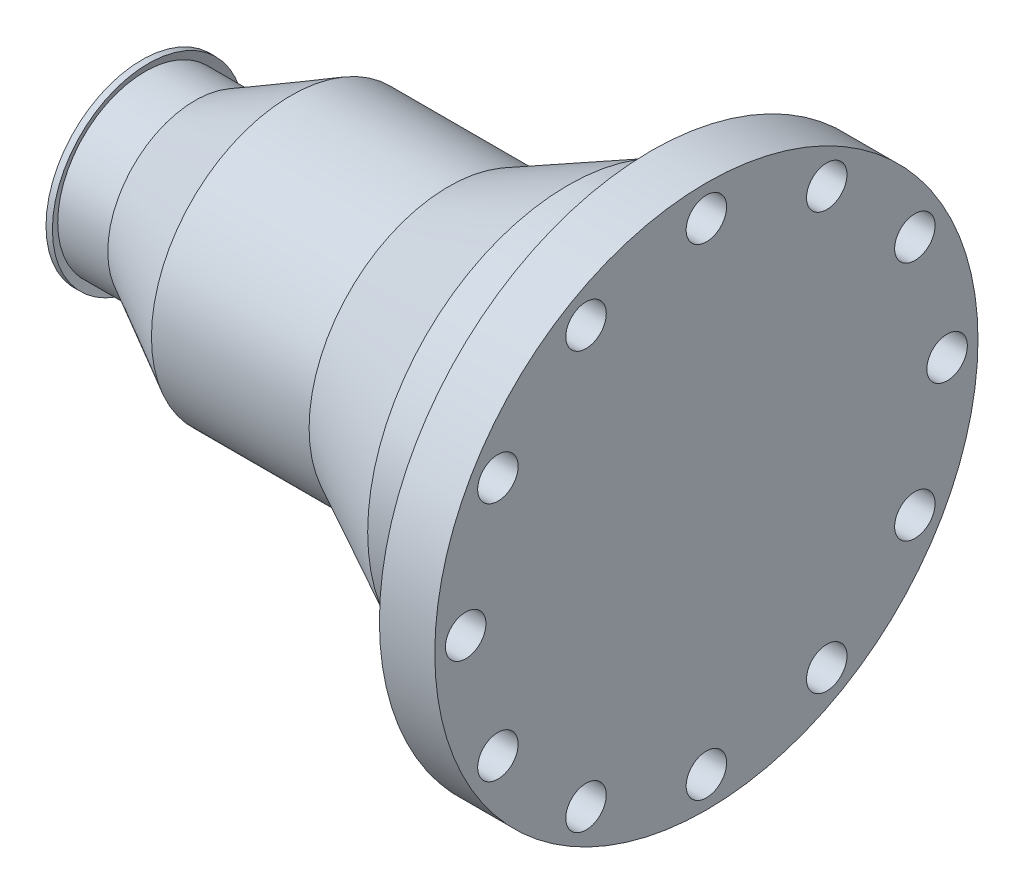
ISO-10303-21;
HEADER;
FILE_DESCRIPTION(('STEP AP214'),'2;1');
FILE_NAME('part.step','',(''),(''),'','','');
FILE_SCHEMA(('AUTOMOTIVE_DESIGN { 1 0 10303 214 1 1 1 1 }'));
ENDSEC;
DATA;
#1=APPLICATION_CONTEXT('core data for automotive mechanical design processes');
#2=APPLICATION_PROTOCOL_DEFINITION('international standard','automotive_design',2000,#1);
#3=PRODUCT_CONTEXT('',#1,'mechanical');
#4=PRODUCT('Part','Part','',(#3));
#5=PRODUCT_RELATED_PRODUCT_CATEGORY('part','',(#4));
#6=PRODUCT_DEFINITION_FORMATION('','',#4);
#7=PRODUCT_DEFINITION_CONTEXT('part definition',#1,'design');
#8=PRODUCT_DEFINITION('design','',#6,#7);
#9=PRODUCT_DEFINITION_SHAPE('','',#8);
#10=(LENGTH_UNIT() NAMED_UNIT(*) SI_UNIT(.MILLI.,.METRE.));
#11=(NAMED_UNIT(*) PLANE_ANGLE_UNIT() SI_UNIT($,.RADIAN.));
#12=(NAMED_UNIT(*) SI_UNIT($,.STERADIAN.) SOLID_ANGLE_UNIT());
#13=UNCERTAINTY_MEASURE_WITH_UNIT(LENGTH_MEASURE(1.E-05),#10,'distance_accuracy_value','');
#14=(GEOMETRIC_REPRESENTATION_CONTEXT(3) GLOBAL_UNCERTAINTY_ASSIGNED_CONTEXT((#13)) GLOBAL_UNIT_ASSIGNED_CONTEXT((#10,
#11,#12)) REPRESENTATION_CONTEXT('',''));
#15=CARTESIAN_POINT('',(0.,0.,0.));
#16=DIRECTION('',(0.,0.,1.));
#17=DIRECTION('',(1.,0.,0.));
#18=AXIS2_PLACEMENT_3D('',#15,#16,#17);
#19=CARTESIAN_POINT('',(0.,0.,0.));
#20=DIRECTION('',(1.,0.,0.));
#21=DIRECTION('',(0.,0.,-1.));
#22=AXIS2_PLACEMENT_3D('',#19,#20,#21);
#23=PLANE('',#22);
#24=CARTESIAN_POINT('',(0.,0.,0.));
#25=DIRECTION('',(-1.,0.,0.));
#26=DIRECTION('',(0.,0.,1.));
#27=AXIS2_PLACEMENT_3D('',#24,#25,#26);
#28=CIRCLE('',#27,31.);
#29=CARTESIAN_POINT('',(0.,0.,31.));
#30=VERTEX_POINT('',#29);
#31=EDGE_CURVE('E80',#30,#30,#28,.T.);
#32=ORIENTED_EDGE('',*,*,#31,.F.);
#33=EDGE_LOOP('',(#32));
#34=FACE_BOUND('',#33,.T.);
#35=CARTESIAN_POINT('',(0.,0.,0.));
#36=DIRECTION('',(-1.,0.,0.));
#37=DIRECTION('',(0.,0.,1.));
#38=AXIS2_PLACEMENT_3D('',#35,#36,#37);
#39=CIRCLE('',#38,45.);
#40=CARTESIAN_POINT('',(0.,0.,45.));
#41=VERTEX_POINT('',#40);
#42=EDGE_CURVE('E10',#41,#41,#39,.T.);
#43=ORIENTED_EDGE('',*,*,#42,.T.);
#44=EDGE_LOOP('',(#43));
#45=FACE_BOUND('',#44,.T.);
#46=ADVANCED_FACE('F37',(#34,#45),#23,.F.);
#47=CARTESIAN_POINT('',(0.,0.,0.));
#48=DIRECTION('',(-1.,0.,0.));
#49=DIRECTION('',(0.,0.,1.));
#50=AXIS2_PLACEMENT_3D('',#47,#48,#49);
#51=CYLINDRICAL_SURFACE('',#50,45.);
#52=ORIENTED_EDGE('',*,*,#42,.F.);
#53=EDGE_LOOP('',(#52));
#54=FACE_BOUND('',#53,.T.);
#55=CARTESIAN_POINT('',(3.,0.,0.));
#56=DIRECTION('',(-1.,0.,0.));
#57=DIRECTION('',(0.,0.,1.));
#58=AXIS2_PLACEMENT_3D('',#55,#56,#57);
#59=CIRCLE('',#58,45.);
#60=CARTESIAN_POINT('',(3.,0.,45.));
#61=VERTEX_POINT('',#60);
#62=EDGE_CURVE('E43',#61,#61,#59,.T.);
#63=ORIENTED_EDGE('',*,*,#62,.T.);
#64=EDGE_LOOP('',(#63));
#65=FACE_BOUND('',#64,.T.);
#66=ADVANCED_FACE('F226',(#54,#65),#51,.T.);
#67=CARTESIAN_POINT('',(1.5,0.,0.));
#68=DIRECTION('',(1.,0.,0.));
#69=DIRECTION('',(0.,0.,-1.));
#70=AXIS2_PLACEMENT_3D('',#67,#68,#69);
#71=CONICAL_SURFACE('',#70,41.,1.21202565652432);
#72=ORIENTED_EDGE('',*,*,#62,.F.);
#73=EDGE_LOOP('',(#72));
#74=FACE_BOUND('',#73,.T.);
#75=CARTESIAN_POINT('',(1.5,0.,0.));
#76=DIRECTION('',(-1.,0.,0.));
#77=DIRECTION('',(0.,0.,1.));
#78=AXIS2_PLACEMENT_3D('',#75,#76,#77);
#79=CIRCLE('',#78,41.);
#80=CARTESIAN_POINT('',(1.5,0.,41.));
#81=VERTEX_POINT('',#80);
#82=EDGE_CURVE('E47',#81,#81,#79,.T.);
#83=ORIENTED_EDGE('',*,*,#82,.T.);
#84=EDGE_LOOP('',(#83));
#85=FACE_BOUND('',#84,.T.);
#86=ADVANCED_FACE('F232',(#74,#85),#71,.F.);
#87=CARTESIAN_POINT('',(0.,0.,0.));
#88=DIRECTION('',(-1.,0.,0.));
#89=DIRECTION('',(0.,0.,1.));
#90=AXIS2_PLACEMENT_3D('',#87,#88,#89);
#91=CYLINDRICAL_SURFACE('',#90,41.);
#92=ORIENTED_EDGE('',*,*,#82,.F.);
#93=EDGE_LOOP('',(#92));
#94=FACE_BOUND('',#93,.T.);
#95=CARTESIAN_POINT('',(25.,0.,0.));
#96=DIRECTION('',(-1.,0.,0.));
#97=DIRECTION('',(0.,0.,1.));
#98=AXIS2_PLACEMENT_3D('',#95,#96,#97);
#99=CIRCLE('',#98,41.);
#100=CARTESIAN_POINT('',(25.,0.,41.));
#101=VERTEX_POINT('',#100);
#102=EDGE_CURVE('E51',#101,#101,#99,.T.);
#103=ORIENTED_EDGE('',*,*,#102,.T.);
#104=EDGE_LOOP('',(#103));
#105=FACE_BOUND('',#104,.T.);
#106=ADVANCED_FACE('F520',(#94,#105),#91,.T.);
#107=CARTESIAN_POINT('',(70.,0.,0.));
#108=DIRECTION('',(1.,0.,0.));
#109=DIRECTION('',(0.,0.,-1.));
#110=AXIS2_PLACEMENT_3D('',#107,#108,#109);
#111=CONICAL_SURFACE('',#110,65.5,0.498567905638218);
#112=ORIENTED_EDGE('',*,*,#102,.F.);
#113=EDGE_LOOP('',(#112));
#114=FACE_BOUND('',#113,.T.);
#115=CARTESIAN_POINT('',(70.,0.,0.));
#116=DIRECTION('',(-1.,0.,0.));
#117=DIRECTION('',(0.,0.,1.));
#118=AXIS2_PLACEMENT_3D('',#115,#116,#117);
#119=CIRCLE('',#118,65.5);
#120=CARTESIAN_POINT('',(70.,0.,65.5));
#121=VERTEX_POINT('',#120);
#122=EDGE_CURVE('E56',#121,#121,#119,.T.);
#123=ORIENTED_EDGE('',*,*,#122,.T.);
#124=EDGE_LOOP('',(#123));
#125=FACE_BOUND('',#124,.T.);
#126=ADVANCED_FACE('F511',(#114,#125),#111,.T.);
#127=CARTESIAN_POINT('',(0.,0.,0.));
#128=DIRECTION('',(-1.,0.,0.));
#129=DIRECTION('',(0.,0.,1.));
#130=AXIS2_PLACEMENT_3D('',#127,#128,#129);
#131=CYLINDRICAL_SURFACE('',#130,65.5);
#132=ORIENTED_EDGE('',*,*,#122,.F.);
#133=EDGE_LOOP('',(#132));
#134=FACE_BOUND('',#133,.T.);
#135=CARTESIAN_POINT('',(144.,0.,0.));
#136=DIRECTION('',(-1.,0.,0.));
#137=DIRECTION('',(0.,0.,1.));
#138=AXIS2_PLACEMENT_3D('',#135,#136,#137);
#139=CIRCLE('',#138,65.5);
#140=CARTESIAN_POINT('',(144.,0.,65.5));
#141=VERTEX_POINT('',#140);
#142=EDGE_CURVE('E59',#141,#141,#139,.T.);
#143=ORIENTED_EDGE('',*,*,#142,.T.);
#144=EDGE_LOOP('',(#143));
#145=FACE_BOUND('',#144,.T.);
#146=ADVANCED_FACE('F502',(#134,#145),#131,.T.);
#147=CARTESIAN_POINT('',(200.,0.,0.));
#148=DIRECTION('',(1.,0.,0.));
#149=DIRECTION('',(0.,0.,-1.));
#150=AXIS2_PLACEMENT_3D('',#147,#148,#149);
#151=CONICAL_SURFACE('',#150,94.,0.470764926542016);
#152=ORIENTED_EDGE('',*,*,#142,.F.);
#153=EDGE_LOOP('',(#152));
#154=FACE_BOUND('',#153,.T.);
#155=CARTESIAN_POINT('',(200.,0.,0.));
#156=DIRECTION('',(-1.,0.,0.));
#157=DIRECTION('',(0.,0.,1.));
#158=AXIS2_PLACEMENT_3D('',#155,#156,#157);
#159=CIRCLE('',#158,94.);
#160=CARTESIAN_POINT('',(200.,0.,94.));
#161=VERTEX_POINT('',#160);
#162=EDGE_CURVE('E62',#161,#161,#159,.T.);
#163=ORIENTED_EDGE('',*,*,#162,.T.);
#164=EDGE_LOOP('',(#163));
#165=FACE_BOUND('',#164,.T.);
#166=ADVANCED_FACE('F493',(#154,#165),#151,.T.);
#167=CARTESIAN_POINT('',(0.,0.,0.));
#168=DIRECTION('',(-1.,0.,0.));
#169=DIRECTION('',(0.,0.,1.));
#170=AXIS2_PLACEMENT_3D('',#167,#168,#169);
#171=CYLINDRICAL_SURFACE('',#170,94.);
#172=ORIENTED_EDGE('',*,*,#162,.F.);
#173=EDGE_LOOP('',(#172));
#174=FACE_BOUND('',#173,.T.);
#175=CARTESIAN_POINT('',(220.,0.,0.));
#176=DIRECTION('',(-1.,0.,0.));
#177=DIRECTION('',(0.,0.,1.));
#178=AXIS2_PLACEMENT_3D('',#175,#176,#177);
#179=CIRCLE('',#178,94.);
#180=CARTESIAN_POINT('',(220.,0.,94.));
#181=VERTEX_POINT('',#180);
#182=EDGE_CURVE('E65',#181,#181,#179,.T.);
#183=ORIENTED_EDGE('',*,*,#182,.T.);
#184=EDGE_LOOP('',(#183));
#185=FACE_BOUND('',#184,.T.);
#186=ADVANCED_FACE('F484',(#174,#185),#171,.T.);
#187=CARTESIAN_POINT('',(220.,94.,0.));
#188=DIRECTION('',(1.,0.,0.));
#189=DIRECTION('',(0.,0.,-1.));
#190=AXIS2_PLACEMENT_3D('',#187,#188,#189);
#191=PLANE('',#190);
#192=ORIENTED_EDGE('',*,*,#182,.F.);
#193=EDGE_LOOP('',(#192));
#194=FACE_BOUND('',#193,.T.);
#195=CARTESIAN_POINT('',(220.,0.,0.));
#196=DIRECTION('',(-1.,0.,0.));
#197=DIRECTION('',(0.,0.,1.));
#198=AXIS2_PLACEMENT_3D('',#195,#196,#197);
#199=CIRCLE('',#198,95.);
#200=CARTESIAN_POINT('',(220.,0.,95.));
#201=VERTEX_POINT('',#200);
#202=EDGE_CURVE('E68',#201,#201,#199,.T.);
#203=ORIENTED_EDGE('',*,*,#202,.T.);
#204=EDGE_LOOP('',(#203));
#205=FACE_BOUND('',#204,.T.);
#206=ADVANCED_FACE('F475',(#194,#205),#191,.F.);
#207=CARTESIAN_POINT('',(0.,0.,0.));
#208=DIRECTION('',(-1.,0.,0.));
#209=DIRECTION('',(0.,0.,1.));
#210=AXIS2_PLACEMENT_3D('',#207,#208,#209);
#211=CYLINDRICAL_SURFACE('',#210,95.);
#212=ORIENTED_EDGE('',*,*,#202,.F.);
#213=EDGE_LOOP('',(#212));
#214=FACE_BOUND('',#213,.T.);
#215=CARTESIAN_POINT('',(239.,0.,0.));
#216=DIRECTION('',(-1.,0.,0.));
#217=DIRECTION('',(0.,0.,1.));
#218=AXIS2_PLACEMENT_3D('',#215,#216,#217);
#219=CIRCLE('',#218,95.);
#220=CARTESIAN_POINT('',(239.,0.,95.));
#221=VERTEX_POINT('',#220);
#222=EDGE_CURVE('E71',#221,#221,#219,.T.);
#223=ORIENTED_EDGE('',*,*,#222,.T.);
#224=EDGE_LOOP('',(#223));
#225=FACE_BOUND('',#224,.T.);
#226=ADVANCED_FACE('F222',(#214,#225),#211,.T.);
#227=CARTESIAN_POINT('',(239.,100.,0.));
#228=DIRECTION('',(1.,0.,0.));
#229=DIRECTION('',(0.,0.,-1.));
#230=AXIS2_PLACEMENT_3D('',#227,#228,#229);
#231=PLANE('',#230);
#232=CARTESIAN_POINT('',(239.,97.8608706276416,-56.5));
#233=DIRECTION('',(1.,0.,0.));
#234=DIRECTION('',(0.,0.,-1.));
#235=AXIS2_PLACEMENT_3D('',#232,#233,#234);
#236=CIRCLE('',#235,9.50000000000001);
#237=CARTESIAN_POINT('',(239.,97.8608706276416,-66.));
#238=VERTEX_POINT('',#237);
#239=EDGE_CURVE('E173',#238,#238,#236,.F.);
#240=ORIENTED_EDGE('',*,*,#239,.F.);
#241=EDGE_LOOP('',(#240));
#242=FACE_BOUND('',#241,.T.);
#243=CARTESIAN_POINT('',(239.,56.4999999999999,-97.8608706276416));
#244=DIRECTION('',(1.,0.,0.));
#245=DIRECTION('',(0.,0.,-1.));
#246=AXIS2_PLACEMENT_3D('',#243,#244,#245);
#247=CIRCLE('',#246,9.5);
#248=CARTESIAN_POINT('',(239.,56.4999999999999,-107.360870627642));
#249=VERTEX_POINT('',#248);
#250=EDGE_CURVE('E167',#249,#249,#247,.F.);
#251=ORIENTED_EDGE('',*,*,#250,.F.);
#252=EDGE_LOOP('',(#251));
#253=FACE_BOUND('',#252,.T.);
#254=CARTESIAN_POINT('',(239.,0.,-113.));
#255=DIRECTION('',(1.,0.,0.));
#256=DIRECTION('',(0.,0.,-1.));
#257=AXIS2_PLACEMENT_3D('',#254,#255,#256);
#258=CIRCLE('',#257,9.49999999999999);
#259=CARTESIAN_POINT('',(239.,0.,-122.5));
#260=VERTEX_POINT('',#259);
#261=EDGE_CURVE('E161',#260,#260,#258,.F.);
#262=ORIENTED_EDGE('',*,*,#261,.F.);
#263=EDGE_LOOP('',(#262));
#264=FACE_BOUND('',#263,.T.);
#265=CARTESIAN_POINT('',(239.,-56.5,-97.8608706276415));
#266=DIRECTION('',(1.,0.,0.));
#267=DIRECTION('',(0.,0.,-1.));
#268=AXIS2_PLACEMENT_3D('',#265,#266,#267);
#269=CIRCLE('',#268,9.5);
#270=CARTESIAN_POINT('',(239.,-56.5,-107.360870627642));
#271=VERTEX_POINT('',#270);
#272=EDGE_CURVE('E155',#271,#271,#269,.F.);
#273=ORIENTED_EDGE('',*,*,#272,.F.);
#274=EDGE_LOOP('',(#273));
#275=FACE_BOUND('',#274,.T.);
#276=CARTESIAN_POINT('',(239.,-97.8608706276416,-56.5));
#277=DIRECTION('',(1.,0.,0.));
#278=DIRECTION('',(0.,0.,-1.));
#279=AXIS2_PLACEMENT_3D('',#276,#277,#278);
#280=CIRCLE('',#279,9.50000000000001);
#281=CARTESIAN_POINT('',(239.,-97.8608706276416,-66.));
#282=VERTEX_POINT('',#281);
#283=EDGE_CURVE('E149',#282,#282,#280,.F.);
#284=ORIENTED_EDGE('',*,*,#283,.F.);
#285=EDGE_LOOP('',(#284));
#286=FACE_BOUND('',#285,.T.);
#287=CARTESIAN_POINT('',(239.,-113.,0.));
#288=DIRECTION('',(1.,0.,0.));
#289=DIRECTION('',(0.,0.,-1.));
#290=AXIS2_PLACEMENT_3D('',#287,#288,#289);
#291=CIRCLE('',#290,9.49999999999998);
#292=CARTESIAN_POINT('',(239.,-113.,-9.49999999999998));
#293=VERTEX_POINT('',#292);
#294=EDGE_CURVE('E143',#293,#293,#291,.F.);
#295=ORIENTED_EDGE('',*,*,#294,.F.);
#296=EDGE_LOOP('',(#295));
#297=FACE_BOUND('',#296,.T.);
#298=CARTESIAN_POINT('',(239.,-97.8608706276415,56.5));
#299=DIRECTION('',(1.,0.,0.));
#300=DIRECTION('',(0.,0.,-1.));
#301=AXIS2_PLACEMENT_3D('',#298,#299,#300);
#302=CIRCLE('',#301,9.5);
#303=CARTESIAN_POINT('',(239.,-97.8608706276415,47.));
#304=VERTEX_POINT('',#303);
#305=EDGE_CURVE('E137',#304,#304,#302,.F.);
#306=ORIENTED_EDGE('',*,*,#305,.F.);
#307=EDGE_LOOP('',(#306));
#308=FACE_BOUND('',#307,.T.);
#309=CARTESIAN_POINT('',(239.,-56.5,97.8608706276416));
#310=DIRECTION('',(1.,0.,0.));
#311=DIRECTION('',(0.,0.,-1.));
#312=AXIS2_PLACEMENT_3D('',#309,#310,#311);
#313=CIRCLE('',#312,9.5);
#314=CARTESIAN_POINT('',(239.,-56.5,88.3608706276416));
#315=VERTEX_POINT('',#314);
#316=EDGE_CURVE('E131',#315,#315,#313,.F.);
#317=ORIENTED_EDGE('',*,*,#316,.F.);
#318=EDGE_LOOP('',(#317));
#319=FACE_BOUND('',#318,.T.);
#320=CARTESIAN_POINT('',(239.,0.,113.));
#321=DIRECTION('',(1.,0.,0.));
#322=DIRECTION('',(0.,0.,-1.));
#323=AXIS2_PLACEMENT_3D('',#320,#321,#322);
#324=CIRCLE('',#323,9.49999999999999);
#325=CARTESIAN_POINT('',(239.,0.,103.5));
#326=VERTEX_POINT('',#325);
#327=EDGE_CURVE('E125',#326,#326,#324,.F.);
#328=ORIENTED_EDGE('',*,*,#327,.F.);
#329=EDGE_LOOP('',(#328));
#330=FACE_BOUND('',#329,.T.);
#331=CARTESIAN_POINT('',(239.,56.5,97.8608706276416));
#332=DIRECTION('',(1.,0.,0.));
#333=DIRECTION('',(0.,0.,-1.));
#334=AXIS2_PLACEMENT_3D('',#331,#332,#333);
#335=CIRCLE('',#334,9.5);
#336=CARTESIAN_POINT('',(239.,56.5,88.3608706276416));
#337=VERTEX_POINT('',#336);
#338=EDGE_CURVE('E119',#337,#337,#335,.F.);
#339=ORIENTED_EDGE('',*,*,#338,.F.);
#340=EDGE_LOOP('',(#339));
#341=FACE_BOUND('',#340,.T.);
#342=CARTESIAN_POINT('',(239.,97.8608706276416,56.5));
#343=DIRECTION('',(1.,0.,0.));
#344=DIRECTION('',(0.,0.,-1.));
#345=AXIS2_PLACEMENT_3D('',#342,#343,#344);
#346=CIRCLE('',#345,9.5);
#347=CARTESIAN_POINT('',(239.,97.8608706276416,47.));
#348=VERTEX_POINT('',#347);
#349=EDGE_CURVE('E113',#348,#348,#346,.F.);
#350=ORIENTED_EDGE('',*,*,#349,.F.);
#351=EDGE_LOOP('',(#350));
#352=FACE_BOUND('',#351,.T.);
#353=CARTESIAN_POINT('',(239.,113.,0.));
#354=DIRECTION('',(1.,0.,0.));
#355=DIRECTION('',(0.,0.,-1.));
#356=AXIS2_PLACEMENT_3D('',#353,#354,#355);
#357=CIRCLE('',#356,9.50000000000001);
#358=CARTESIAN_POINT('',(239.,113.,-9.50000000000001));
#359=VERTEX_POINT('',#358);
#360=EDGE_CURVE('E107',#359,#359,#357,.F.);
#361=ORIENTED_EDGE('',*,*,#360,.F.);
#362=EDGE_LOOP('',(#361));
#363=FACE_BOUND('',#362,.T.);
#364=ORIENTED_EDGE('',*,*,#222,.F.);
#365=EDGE_LOOP('',(#364));
#366=FACE_BOUND('',#365,.T.);
#367=CARTESIAN_POINT('',(239.,0.,0.));
#368=DIRECTION('',(-1.,0.,0.));
#369=DIRECTION('',(0.,0.,1.));
#370=AXIS2_PLACEMENT_3D('',#367,#368,#369);
#371=CIRCLE('',#370,127.5);
#372=CARTESIAN_POINT('',(239.,0.,127.5));
#373=VERTEX_POINT('',#372);
#374=EDGE_CURVE('E74',#373,#373,#371,.T.);
#375=ORIENTED_EDGE('',*,*,#374,.T.);
#376=EDGE_LOOP('',(#375));
#377=FACE_BOUND('',#376,.T.);
#378=ADVANCED_FACE('F214',(#242,#253,#264,#275,#286,#297,#308,#319,#330,#341,#352,#363,#366,
#377),#231,.F.);
#379=CARTESIAN_POINT('',(0.,0.,0.));
#380=DIRECTION('',(-1.,0.,0.));
#381=DIRECTION('',(0.,0.,1.));
#382=AXIS2_PLACEMENT_3D('',#379,#380,#381);
#383=CYLINDRICAL_SURFACE('',#382,127.5);
#384=ORIENTED_EDGE('',*,*,#374,.F.);
#385=EDGE_LOOP('',(#384));
#386=FACE_BOUND('',#385,.T.);
#387=CARTESIAN_POINT('',(265.,0.,0.));
#388=DIRECTION('',(-1.,0.,0.));
#389=DIRECTION('',(0.,0.,1.));
#390=AXIS2_PLACEMENT_3D('',#387,#388,#389);
#391=CIRCLE('',#390,127.5);
#392=CARTESIAN_POINT('',(265.,0.,127.5));
#393=VERTEX_POINT('',#392);
#394=EDGE_CURVE('E77',#393,#393,#391,.T.);
#395=ORIENTED_EDGE('',*,*,#394,.T.);
#396=EDGE_LOOP('',(#395));
#397=FACE_BOUND('',#396,.T.);
#398=ADVANCED_FACE('F187',(#386,#397),#383,.T.);
#399=CARTESIAN_POINT('',(265.,127.5,0.));
#400=DIRECTION('',(-1.,0.,0.));
#401=DIRECTION('',(0.,0.,1.));
#402=AXIS2_PLACEMENT_3D('',#399,#400,#401);
#403=PLANE('',#402);
#404=CARTESIAN_POINT('',(265.,97.8608706276416,-56.5));
#405=DIRECTION('',(1.,0.,0.));
#406=DIRECTION('',(0.,0.,-1.));
#407=AXIS2_PLACEMENT_3D('',#404,#405,#406);
#408=CIRCLE('',#407,9.50000000000001);
#409=CARTESIAN_POINT('',(265.,97.8608706276416,-66.));
#410=VERTEX_POINT('',#409);
#411=EDGE_CURVE('E176',#410,#410,#408,.T.);
#412=ORIENTED_EDGE('',*,*,#411,.F.);
#413=EDGE_LOOP('',(#412));
#414=FACE_BOUND('',#413,.T.);
#415=CARTESIAN_POINT('',(265.,56.4999999999999,-97.8608706276416));
#416=DIRECTION('',(1.,0.,0.));
#417=DIRECTION('',(0.,0.,-1.));
#418=AXIS2_PLACEMENT_3D('',#415,#416,#417);
#419=CIRCLE('',#418,9.5);
#420=CARTESIAN_POINT('',(265.,56.4999999999999,-107.360870627642));
#421=VERTEX_POINT('',#420);
#422=EDGE_CURVE('E170',#421,#421,#419,.T.);
#423=ORIENTED_EDGE('',*,*,#422,.F.);
#424=EDGE_LOOP('',(#423));
#425=FACE_BOUND('',#424,.T.);
#426=CARTESIAN_POINT('',(265.,0.,-113.));
#427=DIRECTION('',(1.,0.,0.));
#428=DIRECTION('',(0.,0.,-1.));
#429=AXIS2_PLACEMENT_3D('',#426,#427,#428);
#430=CIRCLE('',#429,9.49999999999999);
#431=CARTESIAN_POINT('',(265.,0.,-122.5));
#432=VERTEX_POINT('',#431);
#433=EDGE_CURVE('E164',#432,#432,#430,.T.);
#434=ORIENTED_EDGE('',*,*,#433,.F.);
#435=EDGE_LOOP('',(#434));
#436=FACE_BOUND('',#435,.T.);
#437=CARTESIAN_POINT('',(265.,-56.5,-97.8608706276415));
#438=DIRECTION('',(1.,0.,0.));
#439=DIRECTION('',(0.,0.,-1.));
#440=AXIS2_PLACEMENT_3D('',#437,#438,#439);
#441=CIRCLE('',#440,9.5);
#442=CARTESIAN_POINT('',(265.,-56.5,-107.360870627642));
#443=VERTEX_POINT('',#442);
#444=EDGE_CURVE('E158',#443,#443,#441,.T.);
#445=ORIENTED_EDGE('',*,*,#444,.F.);
#446=EDGE_LOOP('',(#445));
#447=FACE_BOUND('',#446,.T.);
#448=CARTESIAN_POINT('',(265.,-97.8608706276416,-56.5));
#449=DIRECTION('',(1.,0.,0.));
#450=DIRECTION('',(0.,0.,-1.));
#451=AXIS2_PLACEMENT_3D('',#448,#449,#450);
#452=CIRCLE('',#451,9.50000000000001);
#453=CARTESIAN_POINT('',(265.,-97.8608706276416,-66.));
#454=VERTEX_POINT('',#453);
#455=EDGE_CURVE('E152',#454,#454,#452,.T.);
#456=ORIENTED_EDGE('',*,*,#455,.F.);
#457=EDGE_LOOP('',(#456));
#458=FACE_BOUND('',#457,.T.);
#459=CARTESIAN_POINT('',(265.,-113.,0.));
#460=DIRECTION('',(1.,0.,0.));
#461=DIRECTION('',(0.,0.,-1.));
#462=AXIS2_PLACEMENT_3D('',#459,#460,#461);
#463=CIRCLE('',#462,9.49999999999998);
#464=CARTESIAN_POINT('',(265.,-113.,-9.49999999999998));
#465=VERTEX_POINT('',#464);
#466=EDGE_CURVE('E146',#465,#465,#463,.T.);
#467=ORIENTED_EDGE('',*,*,#466,.F.);
#468=EDGE_LOOP('',(#467));
#469=FACE_BOUND('',#468,.T.);
#470=CARTESIAN_POINT('',(265.,-97.8608706276415,56.5));
#471=DIRECTION('',(1.,0.,0.));
#472=DIRECTION('',(0.,0.,-1.));
#473=AXIS2_PLACEMENT_3D('',#470,#471,#472);
#474=CIRCLE('',#473,9.5);
#475=CARTESIAN_POINT('',(265.,-97.8608706276415,47.));
#476=VERTEX_POINT('',#475);
#477=EDGE_CURVE('E140',#476,#476,#474,.T.);
#478=ORIENTED_EDGE('',*,*,#477,.F.);
#479=EDGE_LOOP('',(#478));
#480=FACE_BOUND('',#479,.T.);
#481=CARTESIAN_POINT('',(265.,-56.5,97.8608706276416));
#482=DIRECTION('',(1.,0.,0.));
#483=DIRECTION('',(0.,0.,-1.));
#484=AXIS2_PLACEMENT_3D('',#481,#482,#483);
#485=CIRCLE('',#484,9.5);
#486=CARTESIAN_POINT('',(265.,-56.5,88.3608706276416));
#487=VERTEX_POINT('',#486);
#488=EDGE_CURVE('E134',#487,#487,#485,.T.);
#489=ORIENTED_EDGE('',*,*,#488,.F.);
#490=EDGE_LOOP('',(#489));
#491=FACE_BOUND('',#490,.T.);
#492=CARTESIAN_POINT('',(265.,0.,113.));
#493=DIRECTION('',(1.,0.,0.));
#494=DIRECTION('',(0.,0.,-1.));
#495=AXIS2_PLACEMENT_3D('',#492,#493,#494);
#496=CIRCLE('',#495,9.49999999999999);
#497=CARTESIAN_POINT('',(265.,0.,103.5));
#498=VERTEX_POINT('',#497);
#499=EDGE_CURVE('E128',#498,#498,#496,.T.);
#500=ORIENTED_EDGE('',*,*,#499,.F.);
#501=EDGE_LOOP('',(#500));
#502=FACE_BOUND('',#501,.T.);
#503=CARTESIAN_POINT('',(265.,56.5,97.8608706276416));
#504=DIRECTION('',(1.,0.,0.));
#505=DIRECTION('',(0.,0.,-1.));
#506=AXIS2_PLACEMENT_3D('',#503,#504,#505);
#507=CIRCLE('',#506,9.5);
#508=CARTESIAN_POINT('',(265.,56.5,88.3608706276416));
#509=VERTEX_POINT('',#508);
#510=EDGE_CURVE('E122',#509,#509,#507,.T.);
#511=ORIENTED_EDGE('',*,*,#510,.F.);
#512=EDGE_LOOP('',(#511));
#513=FACE_BOUND('',#512,.T.);
#514=CARTESIAN_POINT('',(265.,97.8608706276416,56.5));
#515=DIRECTION('',(1.,0.,0.));
#516=DIRECTION('',(0.,0.,-1.));
#517=AXIS2_PLACEMENT_3D('',#514,#515,#516);
#518=CIRCLE('',#517,9.5);
#519=CARTESIAN_POINT('',(265.,97.8608706276416,47.));
#520=VERTEX_POINT('',#519);
#521=EDGE_CURVE('E116',#520,#520,#518,.T.);
#522=ORIENTED_EDGE('',*,*,#521,.F.);
#523=EDGE_LOOP('',(#522));
#524=FACE_BOUND('',#523,.T.);
#525=CARTESIAN_POINT('',(265.,113.,0.));
#526=DIRECTION('',(1.,0.,0.));
#527=DIRECTION('',(0.,0.,-1.));
#528=AXIS2_PLACEMENT_3D('',#525,#526,#527);
#529=CIRCLE('',#528,9.50000000000001);
#530=CARTESIAN_POINT('',(265.,113.,-9.50000000000001));
#531=VERTEX_POINT('',#530);
#532=EDGE_CURVE('E110',#531,#531,#529,.T.);
#533=ORIENTED_EDGE('',*,*,#532,.F.);
#534=EDGE_LOOP('',(#533));
#535=FACE_BOUND('',#534,.T.);
#536=ORIENTED_EDGE('',*,*,#394,.F.);
#537=EDGE_LOOP('',(#536));
#538=FACE_BOUND('',#537,.T.);
#539=ADVANCED_FACE('F183',(#414,#425,#436,#447,#458,#469,#480,#491,#502,#513,#524,#535,#538),
#403,.F.);
#540=CARTESIAN_POINT('',(0.,0.,0.));
#541=DIRECTION('',(-1.,0.,0.));
#542=DIRECTION('',(0.,0.,1.));
#543=AXIS2_PLACEMENT_3D('',#540,#541,#542);
#544=CYLINDRICAL_SURFACE('',#543,31.);
#545=ORIENTED_EDGE('',*,*,#31,.T.);
#546=EDGE_LOOP('',(#545));
#547=FACE_BOUND('',#546,.T.);
#548=CARTESIAN_POINT('',(42.,0.,0.));
#549=DIRECTION('',(-1.,0.,0.));
#550=DIRECTION('',(0.,0.,1.));
#551=AXIS2_PLACEMENT_3D('',#548,#549,#550);
#552=CIRCLE('',#551,31.);
#553=CARTESIAN_POINT('',(42.,0.,31.));
#554=VERTEX_POINT('',#553);
#555=EDGE_CURVE('E83',#554,#554,#552,.T.);
#556=ORIENTED_EDGE('',*,*,#555,.F.);
#557=EDGE_LOOP('',(#556));
#558=FACE_BOUND('',#557,.T.);
#559=ADVANCED_FACE('F186',(#547,#558),#544,.F.);
#560=CARTESIAN_POINT('',(70.,0.,0.));
#561=DIRECTION('',(1.,0.,0.));
#562=DIRECTION('',(0.,0.,-1.));
#563=AXIS2_PLACEMENT_3D('',#560,#561,#562);
#564=CONICAL_SURFACE('',#563,38.502577,0.261799374867879);
#565=ORIENTED_EDGE('',*,*,#555,.T.);
#566=EDGE_LOOP('',(#565));
#567=FACE_BOUND('',#566,.T.);
#568=CARTESIAN_POINT('',(70.,0.,0.));
#569=DIRECTION('',(-1.,0.,0.));
#570=DIRECTION('',(0.,0.,1.));
#571=AXIS2_PLACEMENT_3D('',#568,#569,#570);
#572=CIRCLE('',#571,38.502577);
#573=CARTESIAN_POINT('',(70.,0.,38.502577));
#574=VERTEX_POINT('',#573);
#575=EDGE_CURVE('E86',#574,#574,#572,.T.);
#576=ORIENTED_EDGE('',*,*,#575,.F.);
#577=EDGE_LOOP('',(#576));
#578=FACE_BOUND('',#577,.T.);
#579=ADVANCED_FACE('F237',(#567,#578),#564,.F.);
#580=CARTESIAN_POINT('',(107.802202951022,0.,0.));
#581=DIRECTION('',(-1.,0.,0.));
#582=DIRECTION('',(0.,0.,1.));
#583=AXIS2_PLACEMENT_3D('',#580,#581,#582);
#584=DEGENERATE_TOROIDAL_SURFACE('',#583,5.77654352226822,49.9999981513586,.T.);
#585=ORIENTED_EDGE('',*,*,#575,.T.);
#586=EDGE_LOOP('',(#585));
#587=FACE_BOUND('',#586,.T.);
#588=CARTESIAN_POINT('',(90.,0.,0.));
#589=DIRECTION('',(-1.,0.,0.));
#590=DIRECTION('',(0.,0.,1.));
#591=AXIS2_PLACEMENT_3D('',#588,#589,#590);
#592=CIRCLE('',#591,52.5);
#593=CARTESIAN_POINT('',(90.,0.,52.5));
#594=VERTEX_POINT('',#593);
#595=EDGE_CURVE('E89',#594,#594,#592,.T.);
#596=ORIENTED_EDGE('',*,*,#595,.F.);
#597=EDGE_LOOP('',(#596));
#598=FACE_BOUND('',#597,.T.);
#599=ADVANCED_FACE('F243',(#587,#598),#584,.F.);
#600=CARTESIAN_POINT('',(0.,0.,0.));
#601=DIRECTION('',(-1.,0.,0.));
#602=DIRECTION('',(0.,0.,1.));
#603=AXIS2_PLACEMENT_3D('',#600,#601,#602);
#604=CYLINDRICAL_SURFACE('',#603,52.5);
#605=ORIENTED_EDGE('',*,*,#595,.T.);
#606=EDGE_LOOP('',(#605));
#607=FACE_BOUND('',#606,.T.);
#608=CARTESIAN_POINT('',(187.,0.,0.));
#609=DIRECTION('',(-1.,0.,0.));
#610=DIRECTION('',(0.,0.,1.));
#611=AXIS2_PLACEMENT_3D('',#608,#609,#610);
#612=CIRCLE('',#611,52.5);
#613=CARTESIAN_POINT('',(187.,0.,52.5));
#614=VERTEX_POINT('',#613);
#615=EDGE_CURVE('E92',#614,#614,#612,.T.);
#616=ORIENTED_EDGE('',*,*,#615,.F.);
#617=EDGE_LOOP('',(#616));
#618=FACE_BOUND('',#617,.T.);
#619=ADVANCED_FACE('F249',(#607,#618),#604,.F.);
#620=CARTESIAN_POINT('',(187.75,0.,0.));
#621=DIRECTION('',(-1.,0.,0.));
#622=DIRECTION('',(0.,0.,1.));
#623=AXIS2_PLACEMENT_3D('',#620,#621,#622);
#624=TOROIDAL_SURFACE('',#623,49.8031848031274,2.79916276877264);
#625=ORIENTED_EDGE('',*,*,#615,.T.);
#626=EDGE_LOOP('',(#625));
#627=FACE_BOUND('',#626,.T.);
#628=CARTESIAN_POINT('',(188.5,0.,0.));
#629=DIRECTION('',(-1.,0.,0.));
#630=DIRECTION('',(0.,0.,1.));
#631=AXIS2_PLACEMENT_3D('',#628,#629,#630);
#632=CIRCLE('',#631,52.5);
#633=CARTESIAN_POINT('',(188.5,0.,52.5));
#634=VERTEX_POINT('',#633);
#635=EDGE_CURVE('E95',#634,#634,#632,.T.);
#636=ORIENTED_EDGE('',*,*,#635,.F.);
#637=EDGE_LOOP('',(#636));
#638=FACE_BOUND('',#637,.T.);
#639=ADVANCED_FACE('F255',(#627,#638),#624,.F.);
#640=CARTESIAN_POINT('',(0.,0.,0.));
#641=DIRECTION('',(-1.,0.,0.));
#642=DIRECTION('',(0.,0.,1.));
#643=AXIS2_PLACEMENT_3D('',#640,#641,#642);
#644=CYLINDRICAL_SURFACE('',#643,52.5);
#645=ORIENTED_EDGE('',*,*,#635,.T.);
#646=EDGE_LOOP('',(#645));
#647=FACE_BOUND('',#646,.T.);
#648=CARTESIAN_POINT('',(191.669873,0.,0.));
#649=DIRECTION('',(-1.,0.,0.));
#650=DIRECTION('',(0.,0.,1.));
#651=AXIS2_PLACEMENT_3D('',#648,#649,#650);
#652=CIRCLE('',#651,52.5);
#653=CARTESIAN_POINT('',(191.669873,0.,52.5));
#654=VERTEX_POINT('',#653);
#655=EDGE_CURVE('E98',#654,#654,#652,.T.);
#656=ORIENTED_EDGE('',*,*,#655,.F.);
#657=EDGE_LOOP('',(#656));
#658=FACE_BOUND('',#657,.T.);
#659=ADVANCED_FACE('F261',(#647,#658),#644,.F.);
#660=CARTESIAN_POINT('',(192.593439045,0.,0.));
#661=DIRECTION('',(-1.,0.,0.));
#662=DIRECTION('',(0.,0.,1.));
#663=AXIS2_PLACEMENT_3D('',#660,#661,#662);
#664=TOROIDAL_SURFACE('',#663,53.580573582,1.42148285448445);
#665=ORIENTED_EDGE('',*,*,#655,.T.);
#666=EDGE_LOOP('',(#665));
#667=FACE_BOUND('',#666,.T.);
#668=CARTESIAN_POINT('',(192.669873,0.,0.));
#669=DIRECTION('',(-1.,0.,0.));
#670=DIRECTION('',(0.,0.,1.));
#671=AXIS2_PLACEMENT_3D('',#668,#669,#670);
#672=CIRCLE('',#671,55.);
#673=CARTESIAN_POINT('',(192.669873,0.,55.));
#674=VERTEX_POINT('',#673);
#675=EDGE_CURVE('E101',#674,#674,#672,.T.);
#676=ORIENTED_EDGE('',*,*,#675,.F.);
#677=EDGE_LOOP('',(#676));
#678=FACE_BOUND('',#677,.T.);
#679=ADVANCED_FACE('F267',(#667,#678),#664,.F.);
#680=CARTESIAN_POINT('',(0.,0.,0.));
#681=DIRECTION('',(-1.,0.,0.));
#682=DIRECTION('',(0.,0.,1.));
#683=AXIS2_PLACEMENT_3D('',#680,#681,#682);
#684=CYLINDRICAL_SURFACE('',#683,55.);
#685=ORIENTED_EDGE('',*,*,#675,.T.);
#686=EDGE_LOOP('',(#685));
#687=FACE_BOUND('',#686,.T.);
#688=CARTESIAN_POINT('',(200.,0.,0.));
#689=DIRECTION('',(-1.,0.,0.));
#690=DIRECTION('',(0.,0.,1.));
#691=AXIS2_PLACEMENT_3D('',#688,#689,#690);
#692=CIRCLE('',#691,55.);
#693=CARTESIAN_POINT('',(200.,0.,55.));
#694=VERTEX_POINT('',#693);
#695=EDGE_CURVE('E104',#694,#694,#692,.T.);
#696=ORIENTED_EDGE('',*,*,#695,.F.);
#697=EDGE_LOOP('',(#696));
#698=FACE_BOUND('',#697,.T.);
#699=ADVANCED_FACE('F273',(#687,#698),#684,.F.);
#700=CARTESIAN_POINT('',(200.,55.,0.));
#701=DIRECTION('',(-1.,0.,0.));
#702=DIRECTION('',(0.,0.,1.));
#703=AXIS2_PLACEMENT_3D('',#700,#701,#702);
#704=PLANE('',#703);
#705=ORIENTED_EDGE('',*,*,#695,.T.);
#706=EDGE_LOOP('',(#705));
#707=FACE_BOUND('',#706,.T.);
#708=ADVANCED_FACE('F279',(#707),#704,.T.);
#709=CARTESIAN_POINT('',(265.,113.,0.));
#710=DIRECTION('',(-1.,0.,0.));
#711=DIRECTION('',(0.,0.,1.));
#712=AXIS2_PLACEMENT_3D('',#709,#710,#711);
#713=CYLINDRICAL_SURFACE('',#712,9.50000000000001);
#714=ORIENTED_EDGE('',*,*,#532,.T.);
#715=EDGE_LOOP('',(#714));
#716=FACE_BOUND('',#715,.T.);
#717=ORIENTED_EDGE('',*,*,#360,.T.);
#718=EDGE_LOOP('',(#717));
#719=FACE_BOUND('',#718,.T.);
#720=ADVANCED_FACE('F284',(#716,#719),#713,.F.);
#721=CARTESIAN_POINT('',(265.,97.8608706276416,56.5));
#722=DIRECTION('',(-1.,0.,0.));
#723=DIRECTION('',(0.,0.,1.));
#724=AXIS2_PLACEMENT_3D('',#721,#722,#723);
#725=CYLINDRICAL_SURFACE('',#724,9.5);
#726=ORIENTED_EDGE('',*,*,#521,.T.);
#727=EDGE_LOOP('',(#726));
#728=FACE_BOUND('',#727,.T.);
#729=ORIENTED_EDGE('',*,*,#349,.T.);
#730=EDGE_LOOP('',(#729));
#731=FACE_BOUND('',#730,.T.);
#732=ADVANCED_FACE('F289',(#728,#731),#725,.F.);
#733=CARTESIAN_POINT('',(265.,56.5,97.8608706276416));
#734=DIRECTION('',(-1.,0.,0.));
#735=DIRECTION('',(0.,0.,1.));
#736=AXIS2_PLACEMENT_3D('',#733,#734,#735);
#737=CYLINDRICAL_SURFACE('',#736,9.5);
#738=ORIENTED_EDGE('',*,*,#510,.T.);
#739=EDGE_LOOP('',(#738));
#740=FACE_BOUND('',#739,.T.);
#741=ORIENTED_EDGE('',*,*,#338,.T.);
#742=EDGE_LOOP('',(#741));
#743=FACE_BOUND('',#742,.T.);
#744=ADVANCED_FACE('F295',(#740,#743),#737,.F.);
#745=CARTESIAN_POINT('',(265.,0.,113.));
#746=DIRECTION('',(-1.,0.,0.));
#747=DIRECTION('',(0.,0.,1.));
#748=AXIS2_PLACEMENT_3D('',#745,#746,#747);
#749=CYLINDRICAL_SURFACE('',#748,9.49999999999999);
#750=ORIENTED_EDGE('',*,*,#499,.T.);
#751=EDGE_LOOP('',(#750));
#752=FACE_BOUND('',#751,.T.);
#753=ORIENTED_EDGE('',*,*,#327,.T.);
#754=EDGE_LOOP('',(#753));
#755=FACE_BOUND('',#754,.T.);
#756=ADVANCED_FACE('F299',(#752,#755),#749,.F.);
#757=CARTESIAN_POINT('',(265.,-56.5,97.8608706276416));
#758=DIRECTION('',(-1.,0.,0.));
#759=DIRECTION('',(0.,0.,1.));
#760=AXIS2_PLACEMENT_3D('',#757,#758,#759);
#761=CYLINDRICAL_SURFACE('',#760,9.5);
#762=ORIENTED_EDGE('',*,*,#488,.T.);
#763=EDGE_LOOP('',(#762));
#764=FACE_BOUND('',#763,.T.);
#765=ORIENTED_EDGE('',*,*,#316,.T.);
#766=EDGE_LOOP('',(#765));
#767=FACE_BOUND('',#766,.T.);
#768=ADVANCED_FACE('F303',(#764,#767),#761,.F.);
#769=CARTESIAN_POINT('',(265.,-97.8608706276415,56.5));
#770=DIRECTION('',(-1.,0.,0.));
#771=DIRECTION('',(0.,0.,1.));
#772=AXIS2_PLACEMENT_3D('',#769,#770,#771);
#773=CYLINDRICAL_SURFACE('',#772,9.5);
#774=ORIENTED_EDGE('',*,*,#477,.T.);
#775=EDGE_LOOP('',(#774));
#776=FACE_BOUND('',#775,.T.);
#777=ORIENTED_EDGE('',*,*,#305,.T.);
#778=EDGE_LOOP('',(#777));
#779=FACE_BOUND('',#778,.T.);
#780=ADVANCED_FACE('F307',(#776,#779),#773,.F.);
#781=CARTESIAN_POINT('',(265.,-113.,0.));
#782=DIRECTION('',(-1.,0.,0.));
#783=DIRECTION('',(0.,0.,1.));
#784=AXIS2_PLACEMENT_3D('',#781,#782,#783);
#785=CYLINDRICAL_SURFACE('',#784,9.49999999999998);
#786=ORIENTED_EDGE('',*,*,#466,.T.);
#787=EDGE_LOOP('',(#786));
#788=FACE_BOUND('',#787,.T.);
#789=ORIENTED_EDGE('',*,*,#294,.T.);
#790=EDGE_LOOP('',(#789));
#791=FACE_BOUND('',#790,.T.);
#792=ADVANCED_FACE('F311',(#788,#791),#785,.F.);
#793=CARTESIAN_POINT('',(265.,-97.8608706276416,-56.5));
#794=DIRECTION('',(-1.,0.,0.));
#795=DIRECTION('',(0.,0.,1.));
#796=AXIS2_PLACEMENT_3D('',#793,#794,#795);
#797=CYLINDRICAL_SURFACE('',#796,9.50000000000001);
#798=ORIENTED_EDGE('',*,*,#455,.T.);
#799=EDGE_LOOP('',(#798));
#800=FACE_BOUND('',#799,.T.);
#801=ORIENTED_EDGE('',*,*,#283,.T.);
#802=EDGE_LOOP('',(#801));
#803=FACE_BOUND('',#802,.T.);
#804=ADVANCED_FACE('F315',(#800,#803),#797,.F.);
#805=CARTESIAN_POINT('',(265.,-56.5,-97.8608706276415));
#806=DIRECTION('',(-1.,0.,0.));
#807=DIRECTION('',(0.,0.,1.));
#808=AXIS2_PLACEMENT_3D('',#805,#806,#807);
#809=CYLINDRICAL_SURFACE('',#808,9.5);
#810=ORIENTED_EDGE('',*,*,#444,.T.);
#811=EDGE_LOOP('',(#810));
#812=FACE_BOUND('',#811,.T.);
#813=ORIENTED_EDGE('',*,*,#272,.T.);
#814=EDGE_LOOP('',(#813));
#815=FACE_BOUND('',#814,.T.);
#816=ADVANCED_FACE('F319',(#812,#815),#809,.F.);
#817=CARTESIAN_POINT('',(265.,0.,-113.));
#818=DIRECTION('',(-1.,0.,0.));
#819=DIRECTION('',(0.,0.,1.));
#820=AXIS2_PLACEMENT_3D('',#817,#818,#819);
#821=CYLINDRICAL_SURFACE('',#820,9.49999999999999);
#822=ORIENTED_EDGE('',*,*,#433,.T.);
#823=EDGE_LOOP('',(#822));
#824=FACE_BOUND('',#823,.T.);
#825=ORIENTED_EDGE('',*,*,#261,.T.);
#826=EDGE_LOOP('',(#825));
#827=FACE_BOUND('',#826,.T.);
#828=ADVANCED_FACE('F323',(#824,#827),#821,.F.);
#829=CARTESIAN_POINT('',(265.,56.4999999999999,-97.8608706276416));
#830=DIRECTION('',(-1.,0.,0.));
#831=DIRECTION('',(0.,0.,1.));
#832=AXIS2_PLACEMENT_3D('',#829,#830,#831);
#833=CYLINDRICAL_SURFACE('',#832,9.5);
#834=ORIENTED_EDGE('',*,*,#422,.T.);
#835=EDGE_LOOP('',(#834));
#836=FACE_BOUND('',#835,.T.);
#837=ORIENTED_EDGE('',*,*,#250,.T.);
#838=EDGE_LOOP('',(#837));
#839=FACE_BOUND('',#838,.T.);
#840=ADVANCED_FACE('F327',(#836,#839),#833,.F.);
#841=CARTESIAN_POINT('',(265.,97.8608706276416,-56.5));
#842=DIRECTION('',(-1.,0.,0.));
#843=DIRECTION('',(0.,0.,1.));
#844=AXIS2_PLACEMENT_3D('',#841,#842,#843);
#845=CYLINDRICAL_SURFACE('',#844,9.50000000000001);
#846=ORIENTED_EDGE('',*,*,#411,.T.);
#847=EDGE_LOOP('',(#846));
#848=FACE_BOUND('',#847,.T.);
#849=ORIENTED_EDGE('',*,*,#239,.T.);
#850=EDGE_LOOP('',(#849));
#851=FACE_BOUND('',#850,.T.);
#852=ADVANCED_FACE('F180',(#848,#851),#845,.F.);
#853=CLOSED_SHELL('',(#46,#66,#86,#106,#126,#146,#166,#186,#206,#226,#378,#398,#539,#559,#579,
#599,#619,#639,#659,#679,#699,#708,#720,#732,#744,#756,#768,#780,#792,#804,#816,#828,#840,#852));
#854=MANIFOLD_SOLID_BREP('B2',#853);
#855=ADVANCED_BREP_SHAPE_REPRESENTATION('',(#18,#854),#14);
#856=SHAPE_DEFINITION_REPRESENTATION(#9,#855);
ENDSEC;
END-ISO-10303-21;
